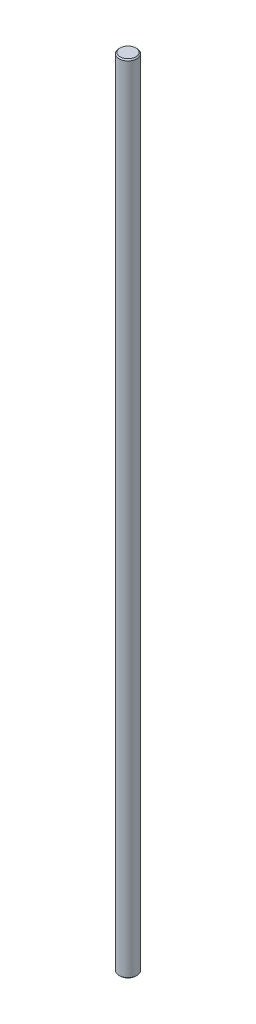
ISO-10303-21;
HEADER;
FILE_DESCRIPTION(('STEP AP214'),'2;1');
FILE_NAME('part.step','',(''),(''),'','','');
FILE_SCHEMA(('AUTOMOTIVE_DESIGN { 1 0 10303 214 1 1 1 1 }'));
ENDSEC;
DATA;
#1=APPLICATION_CONTEXT('core data for automotive mechanical design processes');
#2=APPLICATION_PROTOCOL_DEFINITION('international standard','automotive_design',2000,#1);
#3=PRODUCT_CONTEXT('',#1,'mechanical');
#4=PRODUCT('Part','Part','',(#3));
#5=PRODUCT_RELATED_PRODUCT_CATEGORY('part','',(#4));
#6=PRODUCT_DEFINITION_FORMATION('','',#4);
#7=PRODUCT_DEFINITION_CONTEXT('part definition',#1,'design');
#8=PRODUCT_DEFINITION('design','',#6,#7);
#9=PRODUCT_DEFINITION_SHAPE('','',#8);
#10=(LENGTH_UNIT() NAMED_UNIT(*) SI_UNIT(.MILLI.,.METRE.));
#11=(NAMED_UNIT(*) PLANE_ANGLE_UNIT() SI_UNIT($,.RADIAN.));
#12=(NAMED_UNIT(*) SI_UNIT($,.STERADIAN.) SOLID_ANGLE_UNIT());
#13=UNCERTAINTY_MEASURE_WITH_UNIT(LENGTH_MEASURE(1.E-05),#10,'distance_accuracy_value','');
#14=(GEOMETRIC_REPRESENTATION_CONTEXT(3) GLOBAL_UNCERTAINTY_ASSIGNED_CONTEXT((#13)) GLOBAL_UNIT_ASSIGNED_CONTEXT((#10,
#11,#12)) REPRESENTATION_CONTEXT('',''));
#15=CARTESIAN_POINT('',(0.,0.,0.));
#16=DIRECTION('',(0.,0.,1.));
#17=DIRECTION('',(1.,0.,0.));
#18=AXIS2_PLACEMENT_3D('',#15,#16,#17);
#19=CARTESIAN_POINT('',(0.,357.,0.));
#20=DIRECTION('',(0.,-1.,0.));
#21=DIRECTION('',(0.,0.,-1.));
#22=AXIS2_PLACEMENT_3D('',#19,#20,#21);
#23=CYLINDRICAL_SURFACE('',#22,4.);
#24=CARTESIAN_POINT('',(0.,0.5,0.));
#25=DIRECTION('',(0.,1.,0.));
#26=DIRECTION('',(0.,0.,1.));
#27=AXIS2_PLACEMENT_3D('',#24,#25,#26);
#28=CIRCLE('',#27,4.);
#29=CARTESIAN_POINT('',(0.,0.5,4.));
#30=VERTEX_POINT('',#29);
#31=EDGE_CURVE('E41',#30,#30,#28,.T.);
#32=ORIENTED_EDGE('',*,*,#31,.T.);
#33=EDGE_LOOP('',(#32));
#34=FACE_BOUND('',#33,.T.);
#35=CARTESIAN_POINT('',(0.,356.5,0.));
#36=DIRECTION('',(0.,1.,0.));
#37=DIRECTION('',(0.,0.,1.));
#38=AXIS2_PLACEMENT_3D('',#35,#36,#37);
#39=CIRCLE('',#38,4.);
#40=CARTESIAN_POINT('',(0.,356.5,4.));
#41=VERTEX_POINT('',#40);
#42=EDGE_CURVE('E45',#41,#41,#39,.F.);
#43=ORIENTED_EDGE('',*,*,#42,.T.);
#44=EDGE_LOOP('',(#43));
#45=FACE_BOUND('',#44,.T.);
#46=ADVANCED_FACE('F30',(#34,#45),#23,.T.);
#47=CARTESIAN_POINT('',(0.,357.,0.));
#48=DIRECTION('',(0.,1.,0.));
#49=DIRECTION('',(0.,0.,1.));
#50=AXIS2_PLACEMENT_3D('',#47,#48,#49);
#51=PLANE('',#50);
#52=CARTESIAN_POINT('',(0.,357.,0.));
#53=DIRECTION('',(0.,1.,0.));
#54=DIRECTION('',(0.,0.,1.));
#55=AXIS2_PLACEMENT_3D('',#52,#53,#54);
#56=CIRCLE('',#55,3.5);
#57=CARTESIAN_POINT('',(0.,357.,3.5));
#58=VERTEX_POINT('',#57);
#59=EDGE_CURVE('E10',#58,#58,#56,.T.);
#60=ORIENTED_EDGE('',*,*,#59,.T.);
#61=EDGE_LOOP('',(#60));
#62=FACE_BOUND('',#61,.T.);
#63=ADVANCED_FACE('F61',(#62),#51,.T.);
#64=CARTESIAN_POINT('',(0.,0.,0.));
#65=DIRECTION('',(0.,1.,0.));
#66=DIRECTION('',(0.,0.,1.));
#67=AXIS2_PLACEMENT_3D('',#64,#65,#66);
#68=PLANE('',#67);
#69=CARTESIAN_POINT('',(0.,0.,0.));
#70=DIRECTION('',(0.,1.,0.));
#71=DIRECTION('',(0.,0.,1.));
#72=AXIS2_PLACEMENT_3D('',#69,#70,#71);
#73=CIRCLE('',#72,3.50000000000003);
#74=CARTESIAN_POINT('',(0.,0.,3.50000000000003));
#75=VERTEX_POINT('',#74);
#76=EDGE_CURVE('E37',#75,#75,#73,.F.);
#77=ORIENTED_EDGE('',*,*,#76,.T.);
#78=EDGE_LOOP('',(#77));
#79=FACE_BOUND('',#78,.T.);
#80=ADVANCED_FACE('F58',(#79),#68,.F.);
#81=CARTESIAN_POINT('',(0.,0.5,0.));
#82=DIRECTION('',(0.,1.,0.));
#83=DIRECTION('',(0.,0.,1.));
#84=AXIS2_PLACEMENT_3D('',#81,#82,#83);
#85=CONICAL_SURFACE('',#84,4.,0.785398163397417);
#86=ORIENTED_EDGE('',*,*,#76,.F.);
#87=EDGE_LOOP('',(#86));
#88=FACE_BOUND('',#87,.T.);
#89=ORIENTED_EDGE('',*,*,#31,.F.);
#90=EDGE_LOOP('',(#89));
#91=FACE_BOUND('',#90,.T.);
#92=ADVANCED_FACE('F54',(#88,#91),#85,.T.);
#93=CARTESIAN_POINT('',(0.,357.,0.));
#94=DIRECTION('',(0.,-1.,0.));
#95=DIRECTION('',(0.,0.,-1.));
#96=AXIS2_PLACEMENT_3D('',#93,#94,#95);
#97=CONICAL_SURFACE('',#96,3.5,0.785398163397445);
#98=ORIENTED_EDGE('',*,*,#42,.F.);
#99=EDGE_LOOP('',(#98));
#100=FACE_BOUND('',#99,.T.);
#101=ORIENTED_EDGE('',*,*,#59,.F.);
#102=EDGE_LOOP('',(#101));
#103=FACE_BOUND('',#102,.T.);
#104=ADVANCED_FACE('F32',(#100,#103),#97,.T.);
#105=CLOSED_SHELL('',(#46,#63,#80,#92,#104));
#106=MANIFOLD_SOLID_BREP('B2',#105);
#107=ADVANCED_BREP_SHAPE_REPRESENTATION('',(#18,#106),#14);
#108=SHAPE_DEFINITION_REPRESENTATION(#9,#107);
ENDSEC;
END-ISO-10303-21;
